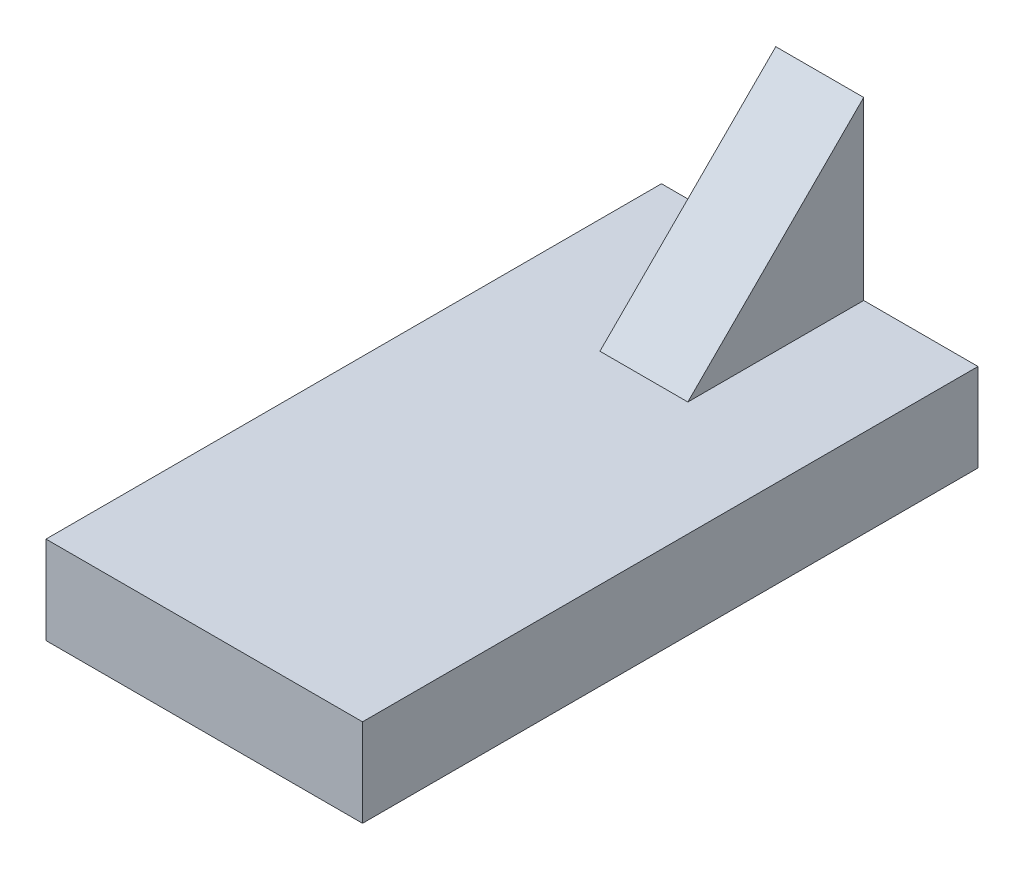
ISO-10303-21;
HEADER;
FILE_DESCRIPTION(('STEP AP214'),'2;1');
FILE_NAME('part.step','',(''),(''),'','','');
FILE_SCHEMA(('AUTOMOTIVE_DESIGN { 1 0 10303 214 1 1 1 1 }'));
ENDSEC;
DATA;
#1=APPLICATION_CONTEXT('core data for automotive mechanical design processes');
#2=APPLICATION_PROTOCOL_DEFINITION('international standard','automotive_design',2000,#1);
#3=PRODUCT_CONTEXT('',#1,'mechanical');
#4=PRODUCT('Part','Part','',(#3));
#5=PRODUCT_RELATED_PRODUCT_CATEGORY('part','',(#4));
#6=PRODUCT_DEFINITION_FORMATION('','',#4);
#7=PRODUCT_DEFINITION_CONTEXT('part definition',#1,'design');
#8=PRODUCT_DEFINITION('design','',#6,#7);
#9=PRODUCT_DEFINITION_SHAPE('','',#8);
#10=(LENGTH_UNIT() NAMED_UNIT(*) SI_UNIT(.MILLI.,.METRE.));
#11=(NAMED_UNIT(*) PLANE_ANGLE_UNIT() SI_UNIT($,.RADIAN.));
#12=(NAMED_UNIT(*) SI_UNIT($,.STERADIAN.) SOLID_ANGLE_UNIT());
#13=UNCERTAINTY_MEASURE_WITH_UNIT(LENGTH_MEASURE(1.E-05),#10,'distance_accuracy_value','');
#14=(GEOMETRIC_REPRESENTATION_CONTEXT(3) GLOBAL_UNCERTAINTY_ASSIGNED_CONTEXT((#13)) GLOBAL_UNIT_ASSIGNED_CONTEXT((#10,
#11,#12)) REPRESENTATION_CONTEXT('',''));
#15=CARTESIAN_POINT('',(0.,0.,0.));
#16=DIRECTION('',(0.,0.,1.));
#17=DIRECTION('',(1.,0.,0.));
#18=AXIS2_PLACEMENT_3D('',#15,#16,#17);
#19=CARTESIAN_POINT('',(-68.6066497970746,-98.7835303855215,953.1542593279));
#20=DIRECTION('',(0.,-1.,0.));
#21=DIRECTION('',(0.,0.,-1.));
#22=AXIS2_PLACEMENT_3D('',#19,#20,#21);
#23=PLANE('',#22);
#24=DIRECTION('',(0.,0.,1.));
#25=VECTOR('',#24,1.);
#26=CARTESIAN_POINT('',(-91.6066497970746,-98.7835303855215,973.1542593279));
#27=LINE('',#26,#25);
#28=CARTESIAN_POINT('',(-91.6066497970746,-98.7835303855215,953.1542593279));
#29=VERTEX_POINT('',#28);
#30=CARTESIAN_POINT('',(-91.6066497970746,-98.7835303855215,973.1542593279));
#31=VERTEX_POINT('',#30);
#32=EDGE_CURVE('E120',#29,#31,#27,.T.);
#33=ORIENTED_EDGE('',*,*,#32,.F.);
#34=DIRECTION('',(1.,0.,0.));
#35=VECTOR('',#34,1.);
#36=CARTESIAN_POINT('',(-68.6066497970746,-98.7835303855215,953.1542593279));
#37=LINE('',#36,#35);
#38=CARTESIAN_POINT('',(-104.606649797075,-98.7835303855215,953.1542593279));
#39=VERTEX_POINT('',#38);
#40=EDGE_CURVE('E139',#39,#29,#37,.T.);
#41=ORIENTED_EDGE('',*,*,#40,.F.);
#42=DIRECTION('',(0.,0.,1.));
#43=VECTOR('',#42,1.);
#44=CARTESIAN_POINT('',(-104.606649797075,-98.7835303855215,953.1542593279));
#45=LINE('',#44,#43);
#46=CARTESIAN_POINT('',(-104.606649797075,-98.7835303855215,1023.1542593279));
#47=VERTEX_POINT('',#46);
#48=EDGE_CURVE('E150',#39,#47,#45,.T.);
#49=ORIENTED_EDGE('',*,*,#48,.T.);
#50=DIRECTION('',(1.,0.,0.));
#51=VECTOR('',#50,1.);
#52=CARTESIAN_POINT('',(-68.6066497970746,-98.7835303855215,1023.1542593279));
#53=LINE('',#52,#51);
#54=CARTESIAN_POINT('',(-68.6066497970746,-98.7835303855215,1023.1542593279));
#55=VERTEX_POINT('',#54);
#56=EDGE_CURVE('E87',#47,#55,#53,.T.);
#57=ORIENTED_EDGE('',*,*,#56,.T.);
#58=DIRECTION('',(0.,0.,1.));
#59=VECTOR('',#58,1.);
#60=CARTESIAN_POINT('',(-68.6066497970746,-98.7835303855215,953.1542593279));
#61=LINE('',#60,#59);
#62=CARTESIAN_POINT('',(-68.6066497970746,-98.7835303855215,953.1542593279));
#63=VERTEX_POINT('',#62);
#64=EDGE_CURVE('E141',#63,#55,#61,.T.);
#65=ORIENTED_EDGE('',*,*,#64,.F.);
#66=CARTESIAN_POINT('',(-81.6066497970746,-98.7835303855215,953.1542593279));
#67=VERTEX_POINT('',#66);
#68=EDGE_CURVE('E65',#67,#63,#37,.T.);
#69=ORIENTED_EDGE('',*,*,#68,.F.);
#70=DIRECTION('',(0.,0.,1.));
#71=VECTOR('',#70,1.);
#72=CARTESIAN_POINT('',(-81.6066497970746,-98.7835303855215,973.1542593279));
#73=LINE('',#72,#71);
#74=CARTESIAN_POINT('',(-81.6066497970746,-98.7835303855215,973.1542593279));
#75=VERTEX_POINT('',#74);
#76=EDGE_CURVE('E127',#67,#75,#73,.T.);
#77=ORIENTED_EDGE('',*,*,#76,.T.);
#78=DIRECTION('',(-1.,0.,0.));
#79=VECTOR('',#78,1.);
#80=CARTESIAN_POINT('',(-81.6066497970746,-98.7835303855215,973.1542593279));
#81=LINE('',#80,#79);
#82=EDGE_CURVE('E114',#75,#31,#81,.T.);
#83=ORIENTED_EDGE('',*,*,#82,.T.);
#84=EDGE_LOOP('',(#33,#41,#49,#57,#65,#69,#77,#83));
#85=FACE_BOUND('',#84,.T.);
#86=ADVANCED_FACE('F41',(#85),#23,.F.);
#87=CARTESIAN_POINT('',(-68.6066497970746,-108.783530385521,953.1542593279));
#88=DIRECTION('',(-1.,0.,0.));
#89=DIRECTION('',(0.,0.,1.));
#90=AXIS2_PLACEMENT_3D('',#87,#88,#89);
#91=PLANE('',#90);
#92=DIRECTION('',(0.,-1.,0.));
#93=VECTOR('',#92,1.);
#94=CARTESIAN_POINT('',(-68.6066497970746,-108.783530385521,1023.1542593279));
#95=LINE('',#94,#93);
#96=CARTESIAN_POINT('',(-68.6066497970746,-108.783530385521,1023.1542593279));
#97=VERTEX_POINT('',#96);
#98=EDGE_CURVE('E130',#55,#97,#95,.T.);
#99=ORIENTED_EDGE('',*,*,#98,.T.);
#100=DIRECTION('',(0.,0.,1.));
#101=VECTOR('',#100,1.);
#102=CARTESIAN_POINT('',(-68.6066497970746,-108.783530385521,953.1542593279));
#103=LINE('',#102,#101);
#104=CARTESIAN_POINT('',(-68.6066497970746,-108.783530385521,953.1542593279));
#105=VERTEX_POINT('',#104);
#106=EDGE_CURVE('E11',#105,#97,#103,.T.);
#107=ORIENTED_EDGE('',*,*,#106,.F.);
#108=DIRECTION('',(0.,-1.,0.));
#109=VECTOR('',#108,1.);
#110=CARTESIAN_POINT('',(-68.6066497970746,-108.783530385521,953.1542593279));
#111=LINE('',#110,#109);
#112=EDGE_CURVE('E134',#63,#105,#111,.T.);
#113=ORIENTED_EDGE('',*,*,#112,.F.);
#114=ORIENTED_EDGE('',*,*,#64,.T.);
#115=EDGE_LOOP('',(#99,#107,#113,#114));
#116=FACE_BOUND('',#115,.T.);
#117=ADVANCED_FACE('F43',(#116),#91,.F.);
#118=CARTESIAN_POINT('',(-68.6066497970746,-108.783530385521,953.1542593279));
#119=DIRECTION('',(0.,1.,0.));
#120=DIRECTION('',(0.,0.,1.));
#121=AXIS2_PLACEMENT_3D('',#118,#119,#120);
#122=PLANE('',#121);
#123=DIRECTION('',(-1.,0.,0.));
#124=VECTOR('',#123,1.);
#125=CARTESIAN_POINT('',(-68.6066497970746,-108.783530385521,1023.1542593279));
#126=LINE('',#125,#124);
#127=CARTESIAN_POINT('',(-104.606649797075,-108.783530385521,1023.1542593279));
#128=VERTEX_POINT('',#127);
#129=EDGE_CURVE('E144',#97,#128,#126,.T.);
#130=ORIENTED_EDGE('',*,*,#129,.T.);
#131=DIRECTION('',(0.,0.,1.));
#132=VECTOR('',#131,1.);
#133=CARTESIAN_POINT('',(-104.606649797075,-108.783530385521,953.1542593279));
#134=LINE('',#133,#132);
#135=CARTESIAN_POINT('',(-104.606649797075,-108.783530385521,953.1542593279));
#136=VERTEX_POINT('',#135);
#137=EDGE_CURVE('E49',#136,#128,#134,.T.);
#138=ORIENTED_EDGE('',*,*,#137,.F.);
#139=DIRECTION('',(-1.,0.,0.));
#140=VECTOR('',#139,1.);
#141=CARTESIAN_POINT('',(-68.6066497970746,-108.783530385521,953.1542593279));
#142=LINE('',#141,#140);
#143=EDGE_CURVE('E94',#105,#136,#142,.T.);
#144=ORIENTED_EDGE('',*,*,#143,.F.);
#145=ORIENTED_EDGE('',*,*,#106,.T.);
#146=EDGE_LOOP('',(#130,#138,#144,#145));
#147=FACE_BOUND('',#146,.T.);
#148=ADVANCED_FACE('F183',(#147),#122,.F.);
#149=CARTESIAN_POINT('',(-104.606649797075,-108.783530385521,953.1542593279));
#150=DIRECTION('',(1.,0.,0.));
#151=DIRECTION('',(0.,0.,-1.));
#152=AXIS2_PLACEMENT_3D('',#149,#150,#151);
#153=PLANE('',#152);
#154=DIRECTION('',(0.,1.,0.));
#155=VECTOR('',#154,1.);
#156=CARTESIAN_POINT('',(-104.606649797075,-108.783530385521,1023.1542593279));
#157=LINE('',#156,#155);
#158=EDGE_CURVE('E146',#128,#47,#157,.T.);
#159=ORIENTED_EDGE('',*,*,#158,.T.);
#160=ORIENTED_EDGE('',*,*,#48,.F.);
#161=DIRECTION('',(0.,1.,0.));
#162=VECTOR('',#161,1.);
#163=CARTESIAN_POINT('',(-104.606649797075,-108.783530385521,953.1542593279));
#164=LINE('',#163,#162);
#165=EDGE_CURVE('E137',#136,#39,#164,.T.);
#166=ORIENTED_EDGE('',*,*,#165,.F.);
#167=ORIENTED_EDGE('',*,*,#137,.T.);
#168=EDGE_LOOP('',(#159,#160,#166,#167));
#169=FACE_BOUND('',#168,.T.);
#170=ADVANCED_FACE('F155',(#169),#153,.F.);
#171=CARTESIAN_POINT('',(0.,0.,953.1542593279));
#172=DIRECTION('',(0.,0.,1.));
#173=DIRECTION('',(1.,0.,0.));
#174=AXIS2_PLACEMENT_3D('',#171,#172,#173);
#175=PLANE('',#174);
#176=ORIENTED_EDGE('',*,*,#112,.T.);
#177=ORIENTED_EDGE('',*,*,#143,.T.);
#178=ORIENTED_EDGE('',*,*,#165,.T.);
#179=ORIENTED_EDGE('',*,*,#40,.T.);
#180=DIRECTION('',(0.,-1.,0.));
#181=VECTOR('',#180,1.);
#182=CARTESIAN_POINT('',(-91.6066497970746,-98.7835303855215,953.1542593279));
#183=LINE('',#182,#181);
#184=CARTESIAN_POINT('',(-91.6066497970746,-78.7835303855215,953.1542593279));
#185=VERTEX_POINT('',#184);
#186=EDGE_CURVE('E119',#185,#29,#183,.T.);
#187=ORIENTED_EDGE('',*,*,#186,.F.);
#188=DIRECTION('',(-1.,0.,0.));
#189=VECTOR('',#188,1.);
#190=CARTESIAN_POINT('',(-81.6066497970746,-78.7835303855215,953.1542593279));
#191=LINE('',#190,#189);
#192=CARTESIAN_POINT('',(-81.6066497970746,-78.7835303855215,953.1542593279));
#193=VERTEX_POINT('',#192);
#194=EDGE_CURVE('E116',#193,#185,#191,.T.);
#195=ORIENTED_EDGE('',*,*,#194,.F.);
#196=DIRECTION('',(0.,-1.,0.));
#197=VECTOR('',#196,1.);
#198=CARTESIAN_POINT('',(-81.6066497970746,-98.7835303855215,953.1542593279));
#199=LINE('',#198,#197);
#200=EDGE_CURVE('E128',#193,#67,#199,.T.);
#201=ORIENTED_EDGE('',*,*,#200,.T.);
#202=ORIENTED_EDGE('',*,*,#68,.T.);
#203=EDGE_LOOP('',(#176,#177,#178,#179,#187,#195,#201,#202));
#204=FACE_BOUND('',#203,.T.);
#205=ADVANCED_FACE('F163',(#204),#175,.F.);
#206=CARTESIAN_POINT('',(0.,0.,1023.1542593279));
#207=DIRECTION('',(0.,0.,1.));
#208=DIRECTION('',(1.,0.,0.));
#209=AXIS2_PLACEMENT_3D('',#206,#207,#208);
#210=PLANE('',#209);
#211=ORIENTED_EDGE('',*,*,#98,.F.);
#212=ORIENTED_EDGE('',*,*,#56,.F.);
#213=ORIENTED_EDGE('',*,*,#158,.F.);
#214=ORIENTED_EDGE('',*,*,#129,.F.);
#215=EDGE_LOOP('',(#211,#212,#213,#214));
#216=FACE_BOUND('',#215,.T.);
#217=ADVANCED_FACE('F159',(#216),#210,.T.);
#218=CARTESIAN_POINT('',(-81.6066497970746,-78.7835303855215,953.1542593279));
#219=DIRECTION('',(0.,0.707106781186546,0.707106781186549));
#220=DIRECTION('',(0.,-0.707106781186549,0.707106781186546));
#221=AXIS2_PLACEMENT_3D('',#218,#219,#220);
#222=PLANE('',#221);
#223=ORIENTED_EDGE('',*,*,#194,.T.);
#224=DIRECTION('',(0.,0.707106781186549,-0.707106781186546));
#225=VECTOR('',#224,1.);
#226=CARTESIAN_POINT('',(-91.6066497970746,-78.7835303855215,953.1542593279));
#227=LINE('',#226,#225);
#228=EDGE_CURVE('E110',#31,#185,#227,.T.);
#229=ORIENTED_EDGE('',*,*,#228,.F.);
#230=ORIENTED_EDGE('',*,*,#82,.F.);
#231=DIRECTION('',(0.,0.707106781186549,-0.707106781186546));
#232=VECTOR('',#231,1.);
#233=CARTESIAN_POINT('',(-81.6066497970746,-78.7835303855215,953.1542593279));
#234=LINE('',#233,#232);
#235=EDGE_CURVE('E56',#75,#193,#234,.T.);
#236=ORIENTED_EDGE('',*,*,#235,.T.);
#237=EDGE_LOOP('',(#223,#229,#230,#236));
#238=FACE_BOUND('',#237,.T.);
#239=ADVANCED_FACE('F112',(#238),#222,.T.);
#240=CARTESIAN_POINT('',(-81.6066497970746,0.,0.));
#241=DIRECTION('',(1.,0.,0.));
#242=DIRECTION('',(0.,0.,-1.));
#243=AXIS2_PLACEMENT_3D('',#240,#241,#242);
#244=PLANE('',#243);
#245=ORIENTED_EDGE('',*,*,#76,.F.);
#246=ORIENTED_EDGE('',*,*,#200,.F.);
#247=ORIENTED_EDGE('',*,*,#235,.F.);
#248=EDGE_LOOP('',(#245,#246,#247));
#249=FACE_BOUND('',#248,.T.);
#250=ADVANCED_FACE('F167',(#249),#244,.T.);
#251=CARTESIAN_POINT('',(-91.6066497970746,0.,0.));
#252=DIRECTION('',(1.,0.,0.));
#253=DIRECTION('',(0.,0.,-1.));
#254=AXIS2_PLACEMENT_3D('',#251,#252,#253);
#255=PLANE('',#254);
#256=ORIENTED_EDGE('',*,*,#32,.T.);
#257=ORIENTED_EDGE('',*,*,#228,.T.);
#258=ORIENTED_EDGE('',*,*,#186,.T.);
#259=EDGE_LOOP('',(#256,#257,#258));
#260=FACE_BOUND('',#259,.T.);
#261=ADVANCED_FACE('F123',(#260),#255,.F.);
#262=CLOSED_SHELL('',(#86,#117,#148,#170,#205,#217,#239,#250,#261));
#263=MANIFOLD_SOLID_BREP('B2',#262);
#264=ADVANCED_BREP_SHAPE_REPRESENTATION('',(#18,#263),#14);
#265=SHAPE_DEFINITION_REPRESENTATION(#9,#264);
ENDSEC;
END-ISO-10303-21;
